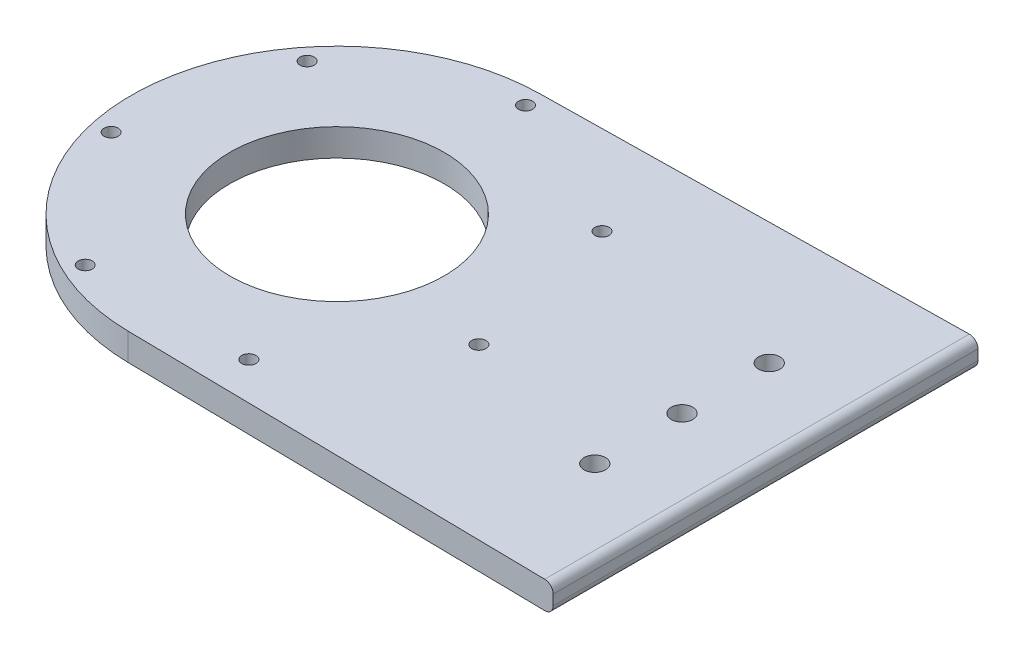
ISO-10303-21;
HEADER;
FILE_DESCRIPTION(('STEP AP214'),'2;1');
FILE_NAME('part.step','',(''),(''),'','','');
FILE_SCHEMA(('AUTOMOTIVE_DESIGN { 1 0 10303 214 1 1 1 1 }'));
ENDSEC;
DATA;
#1=APPLICATION_CONTEXT('core data for automotive mechanical design processes');
#2=APPLICATION_PROTOCOL_DEFINITION('international standard','automotive_design',2000,#1);
#3=PRODUCT_CONTEXT('',#1,'mechanical');
#4=PRODUCT('Part','Part','',(#3));
#5=PRODUCT_RELATED_PRODUCT_CATEGORY('part','',(#4));
#6=PRODUCT_DEFINITION_FORMATION('','',#4);
#7=PRODUCT_DEFINITION_CONTEXT('part definition',#1,'design');
#8=PRODUCT_DEFINITION('design','',#6,#7);
#9=PRODUCT_DEFINITION_SHAPE('','',#8);
#10=(LENGTH_UNIT() NAMED_UNIT(*) SI_UNIT(.MILLI.,.METRE.));
#11=(NAMED_UNIT(*) PLANE_ANGLE_UNIT() SI_UNIT($,.RADIAN.));
#12=(NAMED_UNIT(*) SI_UNIT($,.STERADIAN.) SOLID_ANGLE_UNIT());
#13=UNCERTAINTY_MEASURE_WITH_UNIT(LENGTH_MEASURE(1.E-05),#10,'distance_accuracy_value','');
#14=(GEOMETRIC_REPRESENTATION_CONTEXT(3) GLOBAL_UNCERTAINTY_ASSIGNED_CONTEXT((#13)) GLOBAL_UNIT_ASSIGNED_CONTEXT((#10,
#11,#12)) REPRESENTATION_CONTEXT('',''));
#15=CARTESIAN_POINT('',(0.,0.,0.));
#16=DIRECTION('',(0.,0.,1.));
#17=DIRECTION('',(1.,0.,0.));
#18=AXIS2_PLACEMENT_3D('',#15,#16,#17);
#19=CARTESIAN_POINT('',(-0.744186046511608,6.35,-47.9942307692099));
#20=DIRECTION('',(-0.0155038759689918,0.,-0.999879807691874));
#21=DIRECTION('',(-0.999879807691874,0.,0.0155038759689918));
#22=AXIS2_PLACEMENT_3D('',#19,#20,#21);
#23=PLANE('',#22);
#24=DIRECTION('',(0.,-1.,0.));
#25=VECTOR('',#24,1.);
#26=CARTESIAN_POINT('',(100.,6.35,-49.5563438882534));
#27=LINE('',#26,#25);
#28=CARTESIAN_POINT('',(100.,4.35,-49.5563438882534));
#29=VERTEX_POINT('',#28);
#30=CARTESIAN_POINT('',(100.,2.,-49.5563438882534));
#31=VERTEX_POINT('',#30);
#32=EDGE_CURVE('E127',#29,#31,#27,.T.);
#33=ORIENTED_EDGE('',*,*,#32,.T.);
#34=CARTESIAN_POINT('',(98.,2.,-49.5253324089742));
#35=DIRECTION('',(-0.0155038759689918,0.,-0.999879807691874));
#36=DIRECTION('',(0.999879807691874,0.,-0.0155038759689918));
#37=AXIS2_PLACEMENT_3D('',#34,#35,#36);
#38=ELLIPSE('',#37,2.00024041351211,2.);
#39=CARTESIAN_POINT('',(98.0000000000001,0.,-49.5253324089742));
#40=VERTEX_POINT('',#39);
#41=EDGE_CURVE('E53',#31,#40,#38,.T.);
#42=ORIENTED_EDGE('',*,*,#41,.T.);
#43=DIRECTION('',(0.999879807691874,0.,-0.0155038759689918));
#44=VECTOR('',#43,1.);
#45=CARTESIAN_POINT('',(-0.744186046511608,0.,-47.9942307692099));
#46=LINE('',#45,#44);
#47=CARTESIAN_POINT('',(-0.744186046511608,0.,-47.9942307692099));
#48=VERTEX_POINT('',#47);
#49=EDGE_CURVE('E104',#48,#40,#46,.T.);
#50=ORIENTED_EDGE('',*,*,#49,.F.);
#51=DIRECTION('',(0.,-1.,0.));
#52=VECTOR('',#51,1.);
#53=CARTESIAN_POINT('',(-0.744186046511608,6.35,-47.9942307692099));
#54=LINE('',#53,#52);
#55=CARTESIAN_POINT('',(-0.744186046511608,6.35,-47.9942307692099));
#56=VERTEX_POINT('',#55);
#57=EDGE_CURVE('E99',#56,#48,#54,.T.);
#58=ORIENTED_EDGE('',*,*,#57,.F.);
#59=DIRECTION('',(0.999879807691874,0.,-0.0155038759689918));
#60=VECTOR('',#59,1.);
#61=CARTESIAN_POINT('',(-0.744186046511608,6.35,-47.9942307692099));
#62=LINE('',#61,#60);
#63=CARTESIAN_POINT('',(98.0000000000001,6.35,-49.5253324089742));
#64=VERTEX_POINT('',#63);
#65=EDGE_CURVE('E101',#56,#64,#62,.T.);
#66=ORIENTED_EDGE('',*,*,#65,.T.);
#67=CARTESIAN_POINT('',(98.,4.35,-49.5253324089742));
#68=DIRECTION('',(-0.0155038759689918,0.,-0.999879807691874));
#69=DIRECTION('',(-0.999879807691874,0.,0.0155038759689918));
#70=AXIS2_PLACEMENT_3D('',#67,#68,#69);
#71=ELLIPSE('',#70,2.00024041351211,2.);
#72=EDGE_CURVE('E174',#64,#29,#71,.T.);
#73=ORIENTED_EDGE('',*,*,#72,.T.);
#74=EDGE_LOOP('',(#33,#42,#50,#58,#66,#73));
#75=FACE_BOUND('',#74,.T.);
#76=ADVANCED_FACE('F45',(#75),#23,.T.);
#77=CARTESIAN_POINT('',(0.,6.35,0.));
#78=DIRECTION('',(0.,-1.,0.));
#79=DIRECTION('',(0.,0.,-1.));
#80=AXIS2_PLACEMENT_3D('',#77,#78,#79);
#81=CYLINDRICAL_SURFACE('',#80,48.);
#82=CARTESIAN_POINT('',(0.,0.,0.));
#83=DIRECTION('',(0.,1.,0.));
#84=DIRECTION('',(0.,0.,1.));
#85=AXIS2_PLACEMENT_3D('',#82,#83,#84);
#86=CIRCLE('',#85,48.);
#87=CARTESIAN_POINT('',(-0.744186046511608,0.,47.9942307692099));
#88=VERTEX_POINT('',#87);
#89=EDGE_CURVE('E133',#48,#88,#86,.T.);
#90=ORIENTED_EDGE('',*,*,#89,.T.);
#91=DIRECTION('',(0.,-1.,0.));
#92=VECTOR('',#91,1.);
#93=CARTESIAN_POINT('',(-0.744186046511608,6.35,47.9942307692099));
#94=LINE('',#93,#92);
#95=CARTESIAN_POINT('',(-0.744186046511608,6.35,47.9942307692099));
#96=VERTEX_POINT('',#95);
#97=EDGE_CURVE('E109',#96,#88,#94,.T.);
#98=ORIENTED_EDGE('',*,*,#97,.F.);
#99=CARTESIAN_POINT('',(0.,6.35,0.));
#100=DIRECTION('',(0.,1.,0.));
#101=DIRECTION('',(0.,0.,1.));
#102=AXIS2_PLACEMENT_3D('',#99,#100,#101);
#103=CIRCLE('',#102,48.);
#104=EDGE_CURVE('E113',#56,#96,#103,.T.);
#105=ORIENTED_EDGE('',*,*,#104,.F.);
#106=ORIENTED_EDGE('',*,*,#57,.T.);
#107=EDGE_LOOP('',(#90,#98,#105,#106));
#108=FACE_BOUND('',#107,.T.);
#109=ADVANCED_FACE('F114',(#108),#81,.T.);
#110=CARTESIAN_POINT('',(-0.744186046511608,6.35,47.9942307692099));
#111=DIRECTION('',(0.0155038759689918,0.,-0.999879807691874));
#112=DIRECTION('',(-0.999879807691874,0.,-0.0155038759689918));
#113=AXIS2_PLACEMENT_3D('',#110,#111,#112);
#114=PLANE('',#113);
#115=DIRECTION('',(0.999879807691874,0.,0.0155038759689918));
#116=VECTOR('',#115,1.);
#117=CARTESIAN_POINT('',(-0.744186046511608,0.,47.9942307692099));
#118=LINE('',#117,#116);
#119=CARTESIAN_POINT('',(98.0000000000001,0.,49.5253324089742));
#120=VERTEX_POINT('',#119);
#121=EDGE_CURVE('E122',#88,#120,#118,.T.);
#122=ORIENTED_EDGE('',*,*,#121,.T.);
#123=CARTESIAN_POINT('',(98.,2.,49.5253324089742));
#124=DIRECTION('',(0.0155038759689918,0.,-0.999879807691874));
#125=DIRECTION('',(-0.999879807691874,0.,-0.0155038759689918));
#126=AXIS2_PLACEMENT_3D('',#123,#124,#125);
#127=ELLIPSE('',#126,2.00024041351211,2.);
#128=CARTESIAN_POINT('',(100.,2.,49.5563438882534));
#129=VERTEX_POINT('',#128);
#130=EDGE_CURVE('E168',#120,#129,#127,.F.);
#131=ORIENTED_EDGE('',*,*,#130,.T.);
#132=DIRECTION('',(0.,-1.,0.));
#133=VECTOR('',#132,1.);
#134=CARTESIAN_POINT('',(100.,6.35,49.5563438882534));
#135=LINE('',#134,#133);
#136=CARTESIAN_POINT('',(100.,4.35,49.5563438882534));
#137=VERTEX_POINT('',#136);
#138=EDGE_CURVE('E138',#137,#129,#135,.T.);
#139=ORIENTED_EDGE('',*,*,#138,.F.);
#140=CARTESIAN_POINT('',(98.,4.35,49.5253324089742));
#141=DIRECTION('',(0.0155038759689918,0.,-0.999879807691874));
#142=DIRECTION('',(0.999879807691874,0.,0.0155038759689918));
#143=AXIS2_PLACEMENT_3D('',#140,#141,#142);
#144=ELLIPSE('',#143,2.00024041351211,2.);
#145=CARTESIAN_POINT('',(98.0000000000001,6.35,49.5253324089742));
#146=VERTEX_POINT('',#145);
#147=EDGE_CURVE('E166',#137,#146,#144,.F.);
#148=ORIENTED_EDGE('',*,*,#147,.T.);
#149=DIRECTION('',(0.999879807691874,0.,0.0155038759689918));
#150=VECTOR('',#149,1.);
#151=CARTESIAN_POINT('',(-0.744186046511608,6.35,47.9942307692099));
#152=LINE('',#151,#150);
#153=EDGE_CURVE('E116',#96,#146,#152,.T.);
#154=ORIENTED_EDGE('',*,*,#153,.F.);
#155=ORIENTED_EDGE('',*,*,#97,.T.);
#156=EDGE_LOOP('',(#122,#131,#139,#148,#154,#155));
#157=FACE_BOUND('',#156,.T.);
#158=ADVANCED_FACE('F183',(#157),#114,.F.);
#159=CARTESIAN_POINT('',(0.,6.35,0.));
#160=DIRECTION('',(0.,-1.,0.));
#161=DIRECTION('',(0.,0.,-1.));
#162=AXIS2_PLACEMENT_3D('',#159,#160,#161);
#163=CYLINDRICAL_SURFACE('',#162,25.);
#164=CARTESIAN_POINT('',(0.,6.35,0.));
#165=DIRECTION('',(0.,1.,0.));
#166=DIRECTION('',(0.,0.,1.));
#167=AXIS2_PLACEMENT_3D('',#164,#165,#166);
#168=CIRCLE('',#167,25.);
#169=CARTESIAN_POINT('',(0.,6.35,25.));
#170=VERTEX_POINT('',#169);
#171=EDGE_CURVE('E119',#170,#170,#168,.T.);
#172=ORIENTED_EDGE('',*,*,#171,.T.);
#173=EDGE_LOOP('',(#172));
#174=FACE_BOUND('',#173,.T.);
#175=CARTESIAN_POINT('',(0.,0.,0.));
#176=DIRECTION('',(0.,1.,0.));
#177=DIRECTION('',(0.,0.,1.));
#178=AXIS2_PLACEMENT_3D('',#175,#176,#177);
#179=CIRCLE('',#178,25.);
#180=CARTESIAN_POINT('',(0.,0.,25.));
#181=VERTEX_POINT('',#180);
#182=EDGE_CURVE('E128',#181,#181,#179,.T.);
#183=ORIENTED_EDGE('',*,*,#182,.F.);
#184=EDGE_LOOP('',(#183));
#185=FACE_BOUND('',#184,.T.);
#186=ADVANCED_FACE('F202',(#174,#185),#163,.F.);
#187=CARTESIAN_POINT('',(100.,6.35,0.));
#188=DIRECTION('',(1.,0.,0.));
#189=DIRECTION('',(0.,0.,-1.));
#190=AXIS2_PLACEMENT_3D('',#187,#188,#189);
#191=PLANE('',#190);
#192=ORIENTED_EDGE('',*,*,#138,.T.);
#193=DIRECTION('',(0.,0.,1.));
#194=VECTOR('',#193,1.);
#195=CARTESIAN_POINT('',(100.,2.,-49.5563438882534));
#196=LINE('',#195,#194);
#197=EDGE_CURVE('E66',#129,#31,#196,.F.);
#198=ORIENTED_EDGE('',*,*,#197,.T.);
#199=ORIENTED_EDGE('',*,*,#32,.F.);
#200=DIRECTION('',(0.,0.,1.));
#201=VECTOR('',#200,1.);
#202=CARTESIAN_POINT('',(100.,4.35,0.));
#203=LINE('',#202,#201);
#204=EDGE_CURVE('E170',#29,#137,#203,.T.);
#205=ORIENTED_EDGE('',*,*,#204,.T.);
#206=EDGE_LOOP('',(#192,#198,#199,#205));
#207=FACE_BOUND('',#206,.T.);
#208=ADVANCED_FACE('F184',(#207),#191,.T.);
#209=CARTESIAN_POINT('',(0.,6.35,0.));
#210=DIRECTION('',(0.,1.,0.));
#211=DIRECTION('',(0.,0.,1.));
#212=AXIS2_PLACEMENT_3D('',#209,#210,#211);
#213=PLANE('',#212);
#214=CARTESIAN_POINT('',(0.,6.35,-44.));
#215=DIRECTION('',(0.,1.,0.));
#216=DIRECTION('',(0.,0.,1.));
#217=AXIS2_PLACEMENT_3D('',#214,#215,#216);
#218=CIRCLE('',#217,1.65);
#219=CARTESIAN_POINT('',(0.,6.35,-42.35));
#220=VERTEX_POINT('',#219);
#221=EDGE_CURVE('E163',#220,#220,#218,.T.);
#222=ORIENTED_EDGE('',*,*,#221,.F.);
#223=EDGE_LOOP('',(#222));
#224=FACE_BOUND('',#223,.T.);
#225=CARTESIAN_POINT('',(34.4005852285934,6.35,-27.4335512817842));
#226=DIRECTION('',(0.,1.,0.));
#227=DIRECTION('',(0.,0.,1.));
#228=AXIS2_PLACEMENT_3D('',#225,#226,#227);
#229=CIRCLE('',#228,1.65);
#230=CARTESIAN_POINT('',(34.4005852285934,6.35,-25.7835512817842));
#231=VERTEX_POINT('',#230);
#232=EDGE_CURVE('E159',#231,#231,#229,.T.);
#233=ORIENTED_EDGE('',*,*,#232,.F.);
#234=EDGE_LOOP('',(#233));
#235=FACE_BOUND('',#234,.T.);
#236=CARTESIAN_POINT('',(42.8968281360002,6.35,9.790921094078));
#237=DIRECTION('',(0.,1.,0.));
#238=DIRECTION('',(0.,0.,1.));
#239=AXIS2_PLACEMENT_3D('',#236,#237,#238);
#240=CIRCLE('',#239,1.65);
#241=CARTESIAN_POINT('',(42.8968281360002,6.35,11.440921094078));
#242=VERTEX_POINT('',#241);
#243=EDGE_CURVE('E158',#242,#242,#240,.T.);
#244=ORIENTED_EDGE('',*,*,#243,.F.);
#245=EDGE_LOOP('',(#244));
#246=FACE_BOUND('',#245,.T.);
#247=CARTESIAN_POINT('',(19.0908845211723,6.35,39.6426301877066));
#248=DIRECTION('',(0.,1.,0.));
#249=DIRECTION('',(0.,0.,1.));
#250=AXIS2_PLACEMENT_3D('',#247,#248,#249);
#251=CIRCLE('',#250,1.65);
#252=CARTESIAN_POINT('',(19.0908845211723,6.35,41.2926301877066));
#253=VERTEX_POINT('',#252);
#254=EDGE_CURVE('E277',#253,#253,#251,.T.);
#255=ORIENTED_EDGE('',*,*,#254,.F.);
#256=EDGE_LOOP('',(#255));
#257=FACE_BOUND('',#256,.T.);
#258=CARTESIAN_POINT('',(-19.0908845211729,6.35,39.6426301877063));
#259=DIRECTION('',(0.,1.,0.));
#260=DIRECTION('',(0.,0.,1.));
#261=AXIS2_PLACEMENT_3D('',#258,#259,#260);
#262=CIRCLE('',#261,1.65);
#263=CARTESIAN_POINT('',(-19.0908845211729,6.35,41.2926301877063));
#264=VERTEX_POINT('',#263);
#265=EDGE_CURVE('E154',#264,#264,#262,.T.);
#266=ORIENTED_EDGE('',*,*,#265,.F.);
#267=EDGE_LOOP('',(#266));
#268=FACE_BOUND('',#267,.T.);
#269=CARTESIAN_POINT('',(-42.8968281360003,6.35,9.79092109407743));
#270=DIRECTION('',(0.,1.,0.));
#271=DIRECTION('',(0.,0.,1.));
#272=AXIS2_PLACEMENT_3D('',#269,#270,#271);
#273=CIRCLE('',#272,1.65);
#274=CARTESIAN_POINT('',(-42.8968281360003,6.35,11.4409210940774));
#275=VERTEX_POINT('',#274);
#276=EDGE_CURVE('E153',#275,#275,#273,.T.);
#277=ORIENTED_EDGE('',*,*,#276,.F.);
#278=EDGE_LOOP('',(#277));
#279=FACE_BOUND('',#278,.T.);
#280=CARTESIAN_POINT('',(-34.400585228593,6.35,-27.4335512817847));
#281=DIRECTION('',(0.,1.,0.));
#282=DIRECTION('',(0.,0.,1.));
#283=AXIS2_PLACEMENT_3D('',#280,#281,#282);
#284=CIRCLE('',#283,1.65);
#285=CARTESIAN_POINT('',(-34.400585228593,6.35,-25.7835512817847));
#286=VERTEX_POINT('',#285);
#287=EDGE_CURVE('E149',#286,#286,#284,.T.);
#288=ORIENTED_EDGE('',*,*,#287,.F.);
#289=EDGE_LOOP('',(#288));
#290=FACE_BOUND('',#289,.T.);
#291=CARTESIAN_POINT('',(80.5,6.35,-20.35));
#292=DIRECTION('',(0.,1.,0.));
#293=DIRECTION('',(0.,0.,1.));
#294=AXIS2_PLACEMENT_3D('',#291,#292,#293);
#295=CIRCLE('',#294,2.49999999999999);
#296=CARTESIAN_POINT('',(80.5,6.35,-17.85));
#297=VERTEX_POINT('',#296);
#298=EDGE_CURVE('E145',#297,#297,#295,.T.);
#299=ORIENTED_EDGE('',*,*,#298,.F.);
#300=EDGE_LOOP('',(#299));
#301=FACE_BOUND('',#300,.T.);
#302=CARTESIAN_POINT('',(80.5,6.35,0.));
#303=DIRECTION('',(0.,1.,0.));
#304=DIRECTION('',(0.,0.,1.));
#305=AXIS2_PLACEMENT_3D('',#302,#303,#304);
#306=CIRCLE('',#305,2.49999999999999);
#307=CARTESIAN_POINT('',(80.5,6.35,2.49999999999999));
#308=VERTEX_POINT('',#307);
#309=EDGE_CURVE('E144',#308,#308,#306,.T.);
#310=ORIENTED_EDGE('',*,*,#309,.F.);
#311=EDGE_LOOP('',(#310));
#312=FACE_BOUND('',#311,.T.);
#313=CARTESIAN_POINT('',(80.5,6.35,20.35));
#314=DIRECTION('',(0.,1.,0.));
#315=DIRECTION('',(0.,0.,1.));
#316=AXIS2_PLACEMENT_3D('',#313,#314,#315);
#317=CIRCLE('',#316,2.49999999999999);
#318=CARTESIAN_POINT('',(80.5,6.35,22.85));
#319=VERTEX_POINT('',#318);
#320=EDGE_CURVE('E299',#319,#319,#317,.T.);
#321=ORIENTED_EDGE('',*,*,#320,.F.);
#322=EDGE_LOOP('',(#321));
#323=FACE_BOUND('',#322,.T.);
#324=ORIENTED_EDGE('',*,*,#171,.F.);
#325=EDGE_LOOP('',(#324));
#326=FACE_BOUND('',#325,.T.);
#327=ORIENTED_EDGE('',*,*,#153,.T.);
#328=DIRECTION('',(0.,0.,1.));
#329=VECTOR('',#328,1.);
#330=CARTESIAN_POINT('',(98.,6.35,0.));
#331=LINE('',#330,#329);
#332=EDGE_CURVE('E11',#146,#64,#331,.F.);
#333=ORIENTED_EDGE('',*,*,#332,.T.);
#334=ORIENTED_EDGE('',*,*,#65,.F.);
#335=ORIENTED_EDGE('',*,*,#104,.T.);
#336=EDGE_LOOP('',(#327,#333,#334,#335));
#337=FACE_BOUND('',#336,.T.);
#338=ADVANCED_FACE('F118',(#224,#235,#246,#257,#268,#279,#290,#301,#312,#323,#326,#337),#213,.T.);
#339=CARTESIAN_POINT('',(0.,0.,0.));
#340=DIRECTION('',(0.,1.,0.));
#341=DIRECTION('',(0.,0.,1.));
#342=AXIS2_PLACEMENT_3D('',#339,#340,#341);
#343=PLANE('',#342);
#344=CARTESIAN_POINT('',(0.,0.,-44.));
#345=DIRECTION('',(0.,1.,0.));
#346=DIRECTION('',(0.,0.,1.));
#347=AXIS2_PLACEMENT_3D('',#344,#345,#346);
#348=CIRCLE('',#347,1.65);
#349=CARTESIAN_POINT('',(0.,0.,-42.35));
#350=VERTEX_POINT('',#349);
#351=EDGE_CURVE('E160',#350,#350,#348,.T.);
#352=ORIENTED_EDGE('',*,*,#351,.T.);
#353=EDGE_LOOP('',(#352));
#354=FACE_BOUND('',#353,.T.);
#355=CARTESIAN_POINT('',(34.4005852285934,0.,-27.4335512817842));
#356=DIRECTION('',(0.,1.,0.));
#357=DIRECTION('',(0.,0.,1.));
#358=AXIS2_PLACEMENT_3D('',#355,#356,#357);
#359=CIRCLE('',#358,1.65);
#360=CARTESIAN_POINT('',(34.4005852285934,0.,-25.7835512817842));
#361=VERTEX_POINT('',#360);
#362=EDGE_CURVE('E155',#361,#361,#359,.T.);
#363=ORIENTED_EDGE('',*,*,#362,.T.);
#364=EDGE_LOOP('',(#363));
#365=FACE_BOUND('',#364,.T.);
#366=CARTESIAN_POINT('',(42.8968281360002,0.,9.790921094078));
#367=DIRECTION('',(0.,1.,0.));
#368=DIRECTION('',(0.,0.,1.));
#369=AXIS2_PLACEMENT_3D('',#366,#367,#368);
#370=CIRCLE('',#369,1.65);
#371=CARTESIAN_POINT('',(42.8968281360002,0.,11.440921094078));
#372=VERTEX_POINT('',#371);
#373=EDGE_CURVE('E274',#372,#372,#370,.T.);
#374=ORIENTED_EDGE('',*,*,#373,.T.);
#375=EDGE_LOOP('',(#374));
#376=FACE_BOUND('',#375,.T.);
#377=CARTESIAN_POINT('',(19.0908845211723,0.,39.6426301877066));
#378=DIRECTION('',(0.,1.,0.));
#379=DIRECTION('',(0.,0.,1.));
#380=AXIS2_PLACEMENT_3D('',#377,#378,#379);
#381=CIRCLE('',#380,1.65);
#382=CARTESIAN_POINT('',(19.0908845211723,0.,41.2926301877066));
#383=VERTEX_POINT('',#382);
#384=EDGE_CURVE('E280',#383,#383,#381,.T.);
#385=ORIENTED_EDGE('',*,*,#384,.T.);
#386=EDGE_LOOP('',(#385));
#387=FACE_BOUND('',#386,.T.);
#388=CARTESIAN_POINT('',(-19.0908845211729,0.,39.6426301877063));
#389=DIRECTION('',(0.,1.,0.));
#390=DIRECTION('',(0.,0.,1.));
#391=AXIS2_PLACEMENT_3D('',#388,#389,#390);
#392=CIRCLE('',#391,1.65);
#393=CARTESIAN_POINT('',(-19.0908845211729,0.,41.2926301877063));
#394=VERTEX_POINT('',#393);
#395=EDGE_CURVE('E150',#394,#394,#392,.T.);
#396=ORIENTED_EDGE('',*,*,#395,.T.);
#397=EDGE_LOOP('',(#396));
#398=FACE_BOUND('',#397,.T.);
#399=CARTESIAN_POINT('',(-42.8968281360003,0.,9.79092109407743));
#400=DIRECTION('',(0.,1.,0.));
#401=DIRECTION('',(0.,0.,1.));
#402=AXIS2_PLACEMENT_3D('',#399,#400,#401);
#403=CIRCLE('',#402,1.65);
#404=CARTESIAN_POINT('',(-42.8968281360003,0.,11.4409210940774));
#405=VERTEX_POINT('',#404);
#406=EDGE_CURVE('E287',#405,#405,#403,.T.);
#407=ORIENTED_EDGE('',*,*,#406,.T.);
#408=EDGE_LOOP('',(#407));
#409=FACE_BOUND('',#408,.T.);
#410=CARTESIAN_POINT('',(-34.400585228593,0.,-27.4335512817847));
#411=DIRECTION('',(0.,1.,0.));
#412=DIRECTION('',(0.,0.,1.));
#413=AXIS2_PLACEMENT_3D('',#410,#411,#412);
#414=CIRCLE('',#413,1.65);
#415=CARTESIAN_POINT('',(-34.400585228593,0.,-25.7835512817847));
#416=VERTEX_POINT('',#415);
#417=EDGE_CURVE('E146',#416,#416,#414,.T.);
#418=ORIENTED_EDGE('',*,*,#417,.T.);
#419=EDGE_LOOP('',(#418));
#420=FACE_BOUND('',#419,.T.);
#421=CARTESIAN_POINT('',(80.5,0.,-20.35));
#422=DIRECTION('',(0.,1.,0.));
#423=DIRECTION('',(0.,0.,1.));
#424=AXIS2_PLACEMENT_3D('',#421,#422,#423);
#425=CIRCLE('',#424,2.49999999999999);
#426=CARTESIAN_POINT('',(80.5,0.,-17.85));
#427=VERTEX_POINT('',#426);
#428=EDGE_CURVE('E141',#427,#427,#425,.T.);
#429=ORIENTED_EDGE('',*,*,#428,.T.);
#430=EDGE_LOOP('',(#429));
#431=FACE_BOUND('',#430,.T.);
#432=CARTESIAN_POINT('',(80.5,0.,0.));
#433=DIRECTION('',(0.,1.,0.));
#434=DIRECTION('',(0.,0.,1.));
#435=AXIS2_PLACEMENT_3D('',#432,#433,#434);
#436=CIRCLE('',#435,2.49999999999999);
#437=CARTESIAN_POINT('',(80.5,0.,2.49999999999999));
#438=VERTEX_POINT('',#437);
#439=EDGE_CURVE('E296',#438,#438,#436,.T.);
#440=ORIENTED_EDGE('',*,*,#439,.T.);
#441=EDGE_LOOP('',(#440));
#442=FACE_BOUND('',#441,.T.);
#443=CARTESIAN_POINT('',(80.5,0.,20.35));
#444=DIRECTION('',(0.,1.,0.));
#445=DIRECTION('',(0.,0.,1.));
#446=AXIS2_PLACEMENT_3D('',#443,#444,#445);
#447=CIRCLE('',#446,2.49999999999999);
#448=CARTESIAN_POINT('',(80.5,0.,22.85));
#449=VERTEX_POINT('',#448);
#450=EDGE_CURVE('E131',#449,#449,#447,.T.);
#451=ORIENTED_EDGE('',*,*,#450,.T.);
#452=EDGE_LOOP('',(#451));
#453=FACE_BOUND('',#452,.T.);
#454=ORIENTED_EDGE('',*,*,#182,.T.);
#455=EDGE_LOOP('',(#454));
#456=FACE_BOUND('',#455,.T.);
#457=ORIENTED_EDGE('',*,*,#49,.T.);
#458=DIRECTION('',(0.,0.,1.));
#459=VECTOR('',#458,1.);
#460=CARTESIAN_POINT('',(98.,0.,49.5563438882534));
#461=LINE('',#460,#459);
#462=EDGE_CURVE('E108',#40,#120,#461,.T.);
#463=ORIENTED_EDGE('',*,*,#462,.T.);
#464=ORIENTED_EDGE('',*,*,#121,.F.);
#465=ORIENTED_EDGE('',*,*,#89,.F.);
#466=EDGE_LOOP('',(#457,#463,#464,#465));
#467=FACE_BOUND('',#466,.T.);
#468=ADVANCED_FACE('F179',(#354,#365,#376,#387,#398,#409,#420,#431,#442,#453,#456,#467),#343,.F.);
#469=CARTESIAN_POINT('',(80.5,6.35,20.35));
#470=DIRECTION('',(0.,1.,0.));
#471=DIRECTION('',(0.,0.,1.));
#472=AXIS2_PLACEMENT_3D('',#469,#470,#471);
#473=CYLINDRICAL_SURFACE('',#472,2.49999999999999);
#474=ORIENTED_EDGE('',*,*,#320,.T.);
#475=EDGE_LOOP('',(#474));
#476=FACE_BOUND('',#475,.T.);
#477=ORIENTED_EDGE('',*,*,#450,.F.);
#478=EDGE_LOOP('',(#477));
#479=FACE_BOUND('',#478,.T.);
#480=ADVANCED_FACE('F215',(#476,#479),#473,.F.);
#481=CARTESIAN_POINT('',(80.5,6.35,0.));
#482=DIRECTION('',(0.,1.,0.));
#483=DIRECTION('',(0.,0.,1.));
#484=AXIS2_PLACEMENT_3D('',#481,#482,#483);
#485=CYLINDRICAL_SURFACE('',#484,2.49999999999999);
#486=ORIENTED_EDGE('',*,*,#309,.T.);
#487=EDGE_LOOP('',(#486));
#488=FACE_BOUND('',#487,.T.);
#489=ORIENTED_EDGE('',*,*,#439,.F.);
#490=EDGE_LOOP('',(#489));
#491=FACE_BOUND('',#490,.T.);
#492=ADVANCED_FACE('F222',(#488,#491),#485,.F.);
#493=CARTESIAN_POINT('',(80.5,6.35,-20.35));
#494=DIRECTION('',(0.,1.,0.));
#495=DIRECTION('',(0.,0.,1.));
#496=AXIS2_PLACEMENT_3D('',#493,#494,#495);
#497=CYLINDRICAL_SURFACE('',#496,2.49999999999999);
#498=ORIENTED_EDGE('',*,*,#298,.T.);
#499=EDGE_LOOP('',(#498));
#500=FACE_BOUND('',#499,.T.);
#501=ORIENTED_EDGE('',*,*,#428,.F.);
#502=EDGE_LOOP('',(#501));
#503=FACE_BOUND('',#502,.T.);
#504=ADVANCED_FACE('F231',(#500,#503),#497,.F.);
#505=CARTESIAN_POINT('',(-34.400585228593,6.35,-27.4335512817847));
#506=DIRECTION('',(0.,1.,0.));
#507=DIRECTION('',(0.,0.,1.));
#508=AXIS2_PLACEMENT_3D('',#505,#506,#507);
#509=CYLINDRICAL_SURFACE('',#508,1.65);
#510=ORIENTED_EDGE('',*,*,#287,.T.);
#511=EDGE_LOOP('',(#510));
#512=FACE_BOUND('',#511,.T.);
#513=ORIENTED_EDGE('',*,*,#417,.F.);
#514=EDGE_LOOP('',(#513));
#515=FACE_BOUND('',#514,.T.);
#516=ADVANCED_FACE('F235',(#512,#515),#509,.F.);
#517=CARTESIAN_POINT('',(-42.8968281360003,6.35,9.79092109407743));
#518=DIRECTION('',(0.,1.,0.));
#519=DIRECTION('',(0.,0.,1.));
#520=AXIS2_PLACEMENT_3D('',#517,#518,#519);
#521=CYLINDRICAL_SURFACE('',#520,1.65);
#522=ORIENTED_EDGE('',*,*,#276,.T.);
#523=EDGE_LOOP('',(#522));
#524=FACE_BOUND('',#523,.T.);
#525=ORIENTED_EDGE('',*,*,#406,.F.);
#526=EDGE_LOOP('',(#525));
#527=FACE_BOUND('',#526,.T.);
#528=ADVANCED_FACE('F239',(#524,#527),#521,.F.);
#529=CARTESIAN_POINT('',(-19.0908845211729,6.35,39.6426301877063));
#530=DIRECTION('',(0.,1.,0.));
#531=DIRECTION('',(0.,0.,1.));
#532=AXIS2_PLACEMENT_3D('',#529,#530,#531);
#533=CYLINDRICAL_SURFACE('',#532,1.65);
#534=ORIENTED_EDGE('',*,*,#265,.T.);
#535=EDGE_LOOP('',(#534));
#536=FACE_BOUND('',#535,.T.);
#537=ORIENTED_EDGE('',*,*,#395,.F.);
#538=EDGE_LOOP('',(#537));
#539=FACE_BOUND('',#538,.T.);
#540=ADVANCED_FACE('F243',(#536,#539),#533,.F.);
#541=CARTESIAN_POINT('',(19.0908845211723,6.35,39.6426301877066));
#542=DIRECTION('',(0.,1.,0.));
#543=DIRECTION('',(0.,0.,1.));
#544=AXIS2_PLACEMENT_3D('',#541,#542,#543);
#545=CYLINDRICAL_SURFACE('',#544,1.65);
#546=ORIENTED_EDGE('',*,*,#254,.T.);
#547=EDGE_LOOP('',(#546));
#548=FACE_BOUND('',#547,.T.);
#549=ORIENTED_EDGE('',*,*,#384,.F.);
#550=EDGE_LOOP('',(#549));
#551=FACE_BOUND('',#550,.T.);
#552=ADVANCED_FACE('F247',(#548,#551),#545,.F.);
#553=CARTESIAN_POINT('',(42.8968281360002,6.35,9.790921094078));
#554=DIRECTION('',(0.,1.,0.));
#555=DIRECTION('',(0.,0.,1.));
#556=AXIS2_PLACEMENT_3D('',#553,#554,#555);
#557=CYLINDRICAL_SURFACE('',#556,1.65);
#558=ORIENTED_EDGE('',*,*,#243,.T.);
#559=EDGE_LOOP('',(#558));
#560=FACE_BOUND('',#559,.T.);
#561=ORIENTED_EDGE('',*,*,#373,.F.);
#562=EDGE_LOOP('',(#561));
#563=FACE_BOUND('',#562,.T.);
#564=ADVANCED_FACE('F251',(#560,#563),#557,.F.);
#565=CARTESIAN_POINT('',(34.4005852285934,6.35,-27.4335512817842));
#566=DIRECTION('',(0.,1.,0.));
#567=DIRECTION('',(0.,0.,1.));
#568=AXIS2_PLACEMENT_3D('',#565,#566,#567);
#569=CYLINDRICAL_SURFACE('',#568,1.65);
#570=ORIENTED_EDGE('',*,*,#232,.T.);
#571=EDGE_LOOP('',(#570));
#572=FACE_BOUND('',#571,.T.);
#573=ORIENTED_EDGE('',*,*,#362,.F.);
#574=EDGE_LOOP('',(#573));
#575=FACE_BOUND('',#574,.T.);
#576=ADVANCED_FACE('F255',(#572,#575),#569,.F.);
#577=CARTESIAN_POINT('',(0.,6.35,-44.));
#578=DIRECTION('',(0.,1.,0.));
#579=DIRECTION('',(0.,0.,1.));
#580=AXIS2_PLACEMENT_3D('',#577,#578,#579);
#581=CYLINDRICAL_SURFACE('',#580,1.65);
#582=ORIENTED_EDGE('',*,*,#221,.T.);
#583=EDGE_LOOP('',(#582));
#584=FACE_BOUND('',#583,.T.);
#585=ORIENTED_EDGE('',*,*,#351,.F.);
#586=EDGE_LOOP('',(#585));
#587=FACE_BOUND('',#586,.T.);
#588=ADVANCED_FACE('F191',(#584,#587),#581,.F.);
#589=CARTESIAN_POINT('',(98.,2.,0.));
#590=DIRECTION('',(0.,0.,-1.));
#591=DIRECTION('',(-1.,0.,0.));
#592=AXIS2_PLACEMENT_3D('',#589,#590,#591);
#593=CYLINDRICAL_SURFACE('',#592,2.);
#594=ORIENTED_EDGE('',*,*,#41,.F.);
#595=ORIENTED_EDGE('',*,*,#197,.F.);
#596=ORIENTED_EDGE('',*,*,#130,.F.);
#597=ORIENTED_EDGE('',*,*,#462,.F.);
#598=EDGE_LOOP('',(#594,#595,#596,#597));
#599=FACE_BOUND('',#598,.T.);
#600=ADVANCED_FACE('F180',(#599),#593,.T.);
#601=CARTESIAN_POINT('',(98.,4.35,0.));
#602=DIRECTION('',(0.,0.,1.));
#603=DIRECTION('',(1.,0.,0.));
#604=AXIS2_PLACEMENT_3D('',#601,#602,#603);
#605=CYLINDRICAL_SURFACE('',#604,2.);
#606=ORIENTED_EDGE('',*,*,#72,.F.);
#607=ORIENTED_EDGE('',*,*,#332,.F.);
#608=ORIENTED_EDGE('',*,*,#147,.F.);
#609=ORIENTED_EDGE('',*,*,#204,.F.);
#610=EDGE_LOOP('',(#606,#607,#608,#609));
#611=FACE_BOUND('',#610,.T.);
#612=ADVANCED_FACE('F47',(#611),#605,.T.);
#613=CLOSED_SHELL('',(#76,#109,#158,#186,#208,#338,#468,#480,#492,#504,#516,#528,#540,#552,#564,
#576,#588,#600,#612));
#614=MANIFOLD_SOLID_BREP('B2',#613);
#615=ADVANCED_BREP_SHAPE_REPRESENTATION('',(#18,#614),#14);
#616=SHAPE_DEFINITION_REPRESENTATION(#9,#615);
ENDSEC;
END-ISO-10303-21;
